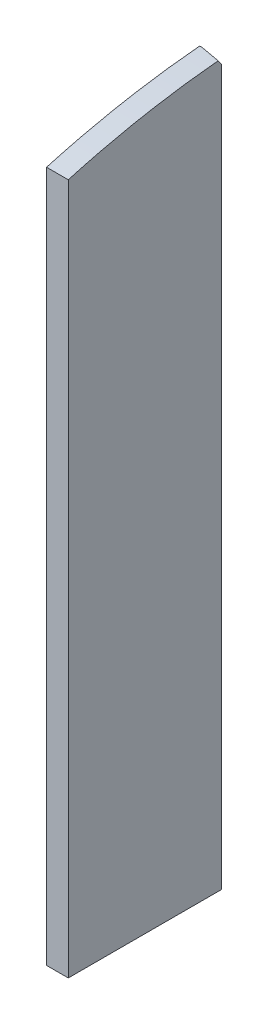
ISO-10303-21;
HEADER;
FILE_DESCRIPTION(('STEP AP214'),'2;1');
FILE_NAME('part.step','',(''),(''),'','','');
FILE_SCHEMA(('AUTOMOTIVE_DESIGN { 1 0 10303 214 1 1 1 1 }'));
ENDSEC;
DATA;
#1=APPLICATION_CONTEXT('core data for automotive mechanical design processes');
#2=APPLICATION_PROTOCOL_DEFINITION('international standard','automotive_design',2000,#1);
#3=PRODUCT_CONTEXT('',#1,'mechanical');
#4=PRODUCT('Part','Part','',(#3));
#5=PRODUCT_RELATED_PRODUCT_CATEGORY('part','',(#4));
#6=PRODUCT_DEFINITION_FORMATION('','',#4);
#7=PRODUCT_DEFINITION_CONTEXT('part definition',#1,'design');
#8=PRODUCT_DEFINITION('design','',#6,#7);
#9=PRODUCT_DEFINITION_SHAPE('','',#8);
#10=(LENGTH_UNIT() NAMED_UNIT(*) SI_UNIT(.MILLI.,.METRE.));
#11=(NAMED_UNIT(*) PLANE_ANGLE_UNIT() SI_UNIT($,.RADIAN.));
#12=(NAMED_UNIT(*) SI_UNIT($,.STERADIAN.) SOLID_ANGLE_UNIT());
#13=UNCERTAINTY_MEASURE_WITH_UNIT(LENGTH_MEASURE(1.E-05),#10,'distance_accuracy_value','');
#14=(GEOMETRIC_REPRESENTATION_CONTEXT(3) GLOBAL_UNCERTAINTY_ASSIGNED_CONTEXT((#13)) GLOBAL_UNIT_ASSIGNED_CONTEXT((#10,
#11,#12)) REPRESENTATION_CONTEXT('',''));
#15=CARTESIAN_POINT('',(0.,0.,0.));
#16=DIRECTION('',(0.,0.,1.));
#17=DIRECTION('',(1.,0.,0.));
#18=AXIS2_PLACEMENT_3D('',#15,#16,#17);
#19=CARTESIAN_POINT('',(137.996769754844,108.257843293921,-0.0146651977824064));
#20=CARTESIAN_POINT('',(137.994470663208,108.263185932301,-0.0146689009284984));
#21=CARTESIAN_POINT('',(137.982846026464,108.272814738817,-0.0146754617601488));
#22=CARTESIAN_POINT('',(137.963867876242,108.292735283424,-0.014689932275715));
#23=CARTESIAN_POINT('',(137.929041901144,108.327108424855,-0.0147177536108103));
#24=CARTESIAN_POINT('',(137.859647450429,108.396180652248,-0.0147853859447906));
#25=CARTESIAN_POINT('',(137.720700231209,108.533729372207,-0.0149685636029773));
#26=CARTESIAN_POINT('',(137.441427493966,108.808046570046,-0.0155738859695163));
#27=CARTESIAN_POINT('',(137.038615499986,109.196243163778,-0.0172511240750879));
#28=CARTESIAN_POINT('',(136.546124174744,109.655278297939,-0.0205386470483546));
#29=CARTESIAN_POINT('',(135.874634570935,110.256454296338,-0.0267672507374783));
#30=CARTESIAN_POINT('',(134.999940648767,110.983855613431,-0.0382928230639124));
#31=CARTESIAN_POINT('',(133.877635548201,111.808260544584,-0.0570483412825666));
#32=CARTESIAN_POINT('',(132.862991226325,112.4422476727,-0.0756814254816192));
#33=CARTESIAN_POINT('',(132.002753907315,112.914961512843,-0.0897246388646096));
#34=CARTESIAN_POINT('',(131.334430505124,113.252920592149,-0.0990531361415634));
#35=CARTESIAN_POINT('',(130.644203811735,113.574264764561,-0.107114757177058));
#36=CARTESIAN_POINT('',(129.934043249993,113.879283140582,-0.114505880462247));
#37=CARTESIAN_POINT('',(129.204854210968,114.168165488837,-0.121098023968528));
#38=CARTESIAN_POINT('',(127.710041789945,114.71321242481,-0.132470685501318));
#39=CARTESIAN_POINT('',(125.871696146492,115.259830104986,-0.142572036123596));
#40=CARTESIAN_POINT('',(123.66821724072,115.758090222137,-0.151320159220091));
#41=CARTESIAN_POINT('',(121.971530023146,116.067506622052,-0.156828844327976));
#42=CARTESIAN_POINT('',(120.237761712036,116.309534388152,-0.161268807965229));
#43=CARTESIAN_POINT('',(117.888826314194,116.540102295787,-0.165351120102883));
#44=CARTESIAN_POINT('',(116.099655086256,116.60985716227,-0.166533184205292));
#45=CARTESIAN_POINT('',(114.908179899786,116.609856795721,-0.166533176427691));
#46=CARTESIAN_POINT('',(114.908166137461,116.60985679571,-0.166533176427521));
#47=CARTESIAN_POINT('',(137.510472650716,107.853561762914,-0.404082727568849));
#48=CARTESIAN_POINT('',(137.507376811193,107.858650018985,-0.404084035787676));
#49=CARTESIAN_POINT('',(137.496391289046,107.868240285266,-0.404086097357336));
#50=CARTESIAN_POINT('',(137.477433389192,107.887690071594,-0.404091100485076));
#51=CARTESIAN_POINT('',(137.443115760932,107.921468114241,-0.404101312217748));
#52=CARTESIAN_POINT('',(137.374606337068,107.989271449082,-0.404128914365074));
#53=CARTESIAN_POINT('',(137.237538732582,108.124383396394,-0.404213210836488));
#54=CARTESIAN_POINT('',(136.962448125101,108.393903765985,-0.404529353106071));
#55=CARTESIAN_POINT('',(136.566783767691,108.776164756471,-0.40549162522133));
#56=CARTESIAN_POINT('',(136.085158319561,109.229282497896,-0.407475000925118));
#57=CARTESIAN_POINT('',(135.430759848289,109.824227268196,-0.411336644773044));
#58=CARTESIAN_POINT('',(134.582075996943,110.547013075342,-0.418684759456099));
#59=CARTESIAN_POINT('',(133.496398206565,111.370213332547,-0.430796964507991));
#60=CARTESIAN_POINT('',(132.514340627424,112.006246471685,-0.442838290777175));
#61=CARTESIAN_POINT('',(131.678968006703,112.480506057578,-0.45191065579327));
#62=CARTESIAN_POINT('',(131.028108580325,112.818899096114,-0.457939508081736));
#63=CARTESIAN_POINT('',(130.354239686885,113.139950158149,-0.46315372611339));
#64=CARTESIAN_POINT('',(129.660076796346,113.444459173849,-0.467938529003803));
#65=CARTESIAN_POINT('',(128.946469220164,113.732516153901,-0.472208534289351));
#66=CARTESIAN_POINT('',(127.482070555638,114.275093943274,-0.479574852615798));
#67=CARTESIAN_POINT('',(125.679020566952,114.818417911478,-0.486118237088277));
#68=CARTESIAN_POINT('',(123.516509181712,115.313474704004,-0.491786875521342));
#69=CARTESIAN_POINT('',(121.851025927126,115.620986894062,-0.495357769785272));
#70=CARTESIAN_POINT('',(120.148898682252,115.86164855112,-0.498236812866679));
#71=CARTESIAN_POINT('',(117.842377907619,116.090852182749,-0.50088390289315));
#72=CARTESIAN_POINT('',(116.085303321296,116.16018160392,-0.501650386384284));
#73=CARTESIAN_POINT('',(114.915212730575,116.160181444212,-0.501650383204009));
#74=CARTESIAN_POINT('',(114.915199215256,116.160181444204,-0.501650383203952));
#75=CARTESIAN_POINT('',(137.028967579147,107.452776598014,-0.781251585381611));
#76=CARTESIAN_POINT('',(137.025079598717,107.457612810647,-0.781250698582326));
#77=CARTESIAN_POINT('',(137.014735660684,107.467165029554,-0.781248515581254));
#78=CARTESIAN_POINT('',(136.995808478246,107.486148551273,-0.781244669848505));
#79=CARTESIAN_POINT('',(136.962014240697,107.519337304045,-0.781238379235461));
#80=CARTESIAN_POINT('',(136.894420859289,107.585884032849,-0.781228460955006));
#81=CARTESIAN_POINT('',(136.759292560085,107.718582721483,-0.781219991505921));
#82=CARTESIAN_POINT('',(136.488498533104,107.983351886824,-0.781264522171981));
#83=CARTESIAN_POINT('',(136.100120316995,108.35973198774,-0.781554434574005));
#84=CARTESIAN_POINT('',(135.62948797464,108.806983927222,-0.782310359699025));
#85=CARTESIAN_POINT('',(134.99229494968,109.395746919926,-0.783942913123056));
#86=CARTESIAN_POINT('',(134.169654987907,110.11394223491,-0.787353931602141));
#87=CARTESIAN_POINT('',(133.120482780799,110.935917827621,-0.793198975367162));
#88=CARTESIAN_POINT('',(132.170796362804,111.573945759457,-0.799015279279175));
#89=CARTESIAN_POINT('',(131.360093934042,112.049712166026,-0.803389474830126));
#90=CARTESIAN_POINT('',(130.726555126049,112.388518472168,-0.806298129298355));
#91=CARTESIAN_POINT('',(130.068903419048,112.709264358142,-0.808818529400483));
#92=CARTESIAN_POINT('',(129.390590139335,113.013254913991,-0.811136572983756));
#93=CARTESIAN_POINT('',(128.692410643563,113.300481502575,-0.81320789809179));
#94=CARTESIAN_POINT('',(127.258110909581,113.840590165171,-0.816779380483254));
#95=CARTESIAN_POINT('',(125.489932244361,114.380629051224,-0.819949508562132));
#96=CARTESIAN_POINT('',(123.367823146718,114.872492225539,-0.822696726453927));
#97=CARTESIAN_POINT('',(121.733082427368,115.178105005634,-0.824428643015011));
#98=CARTESIAN_POINT('',(120.062103692994,115.417402786164,-0.825825984172099));
#99=CARTESIAN_POINT('',(117.797312161971,115.645244996051,-0.827110311589735));
#100=CARTESIAN_POINT('',(116.071796805745,115.714150022894,-0.827482082903629));
#101=CARTESIAN_POINT('',(114.922732355561,115.714150069149,-0.827482083315573));
#102=CARTESIAN_POINT('',(114.922719083107,115.714150069143,-0.827482083315516));
#103=CARTESIAN_POINT('',(136.552016344677,107.0563117822,-1.14566927671962));
#104=CARTESIAN_POINT('',(136.547340432649,107.060898350425,-1.14566637025268));
#105=CARTESIAN_POINT('',(136.537639161453,107.070413329829,-1.14566030054095));
#106=CARTESIAN_POINT('',(136.518750578082,107.088935524444,-1.14564833369843));
#107=CARTESIAN_POINT('',(136.485490308103,107.121541675051,-1.14562688610363));
#108=CARTESIAN_POINT('',(136.418835051944,107.186845781945,-1.1455824366771));
#109=CARTESIAN_POINT('',(136.285688199523,107.317158044883,-1.14548834885238));
#110=CARTESIAN_POINT('',(136.0192709141,107.577227718333,-1.14528122624802));
#111=CARTESIAN_POINT('',(135.63827199632,107.94778883681,-1.14494591370277));
#112=CARTESIAN_POINT('',(135.17871163924,108.389232720069,-1.14455812912644));
#113=CARTESIAN_POINT('',(134.558782896402,108.971867893528,-1.14411104218249));
#114=CARTESIAN_POINT('',(133.76216940203,109.68549577779,-1.14384388679329));
#115=CARTESIAN_POINT('',(132.74934888641,110.506212957014,-1.1438250297044));
#116=CARTESIAN_POINT('',(131.831812742248,111.146164584988,-1.14380813365986));
#117=CARTESIAN_POINT('',(131.045588362452,111.623383271963,-1.14377528142089));
#118=CARTESIAN_POINT('',(130.429229882475,111.962572146577,-1.14375543673324));
#119=CARTESIAN_POINT('',(129.787658918469,112.282992673288,-1.14374628885744));
#120=CARTESIAN_POINT('',(129.125054001999,112.586448332808,-1.14374693152016));
#121=CARTESIAN_POINT('',(128.4421582645,112.872833218141,-1.14375185044409));
#122=CARTESIAN_POINT('',(127.037664698078,113.410462684913,-1.14375554847331));
#123=CARTESIAN_POINT('',(125.303975400221,113.947217065625,-1.14375142174711));
#124=CARTESIAN_POINT('',(123.221772633496,114.435889587303,-1.143747913775));
#125=CARTESIAN_POINT('',(121.617374520222,114.739603296592,-1.14374755467472));
#126=CARTESIAN_POINT('',(119.977121078003,114.977535611407,-1.14374867907284));
#127=CARTESIAN_POINT('',(117.753473199096,115.204015867117,-1.14374853408324));
#128=CARTESIAN_POINT('',(116.059060502344,115.27249663845,-1.1437481533865));
#129=CARTESIAN_POINT('',(114.930717710983,115.272496891759,-1.1437481533894));
#130=CARTESIAN_POINT('',(114.930704677879,115.272496891756,-1.1437481533894));
#131=(BOUNDED_SURFACE() B_SPLINE_SURFACE(3,3,((#19,#20,#21,#22,#23,#24,#25,#26,#27,#28,#29,#30,
#31,#32,#33,#34,#35,#36,#37,#38,#39,#40,#41,#42,#43,#44,#45,#46),(#47,#48,#49,#50,#51,#52,#53,
#54,#55,#56,#57,#58,#59,#60,#61,#62,#63,#64,#65,#66,#67,#68,#69,#70,#71,#72,#73,#74),(#75,#76,
#77,#78,#79,#80,#81,#82,#83,#84,#85,#86,#87,#88,#89,#90,#91,#92,#93,#94,#95,#96,#97,#98,#99,
#100,#101,#102),(#103,#104,#105,#106,#107,#108,#109,#110,#111,#112,#113,#114,#115,#116,#117,
#118,#119,#120,#121,#122,#123,#124,#125,#126,#127,#128,#129,#130)),.UNSPECIFIED.,.F.,.F.,
.F.) B_SPLINE_SURFACE_WITH_KNOTS((4,4),(4,1,1,1,1,1,1,1,1,1,1,1,1,1,1,1,1,1,1,1,1,1,1,1,1,4),
(-8.3522230805065,0.),(0.,0.0293809287067883,0.0587618574135476,0.117523714827124,
0.235047429654219,0.470094859308468,0.940189718616906,1.88037943723384,2.82056915585075,
3.76075887446765,5.64113831170148,7.52151774893531,9.40189718616914,10.342086904786,
11.282276623403,12.2224663420199,13.1626560606368,14.1028457792537,15.0430354978706,
18.8037943723383,20.6841738095721,22.5645532468059,24.4449326840398,26.3253121212736,
30.0860709957413,30.0861144354926),
.UNSPECIFIED.) GEOMETRIC_REPRESENTATION_ITEM() RATIONAL_B_SPLINE_SURFACE(((1.,1.,1.,1.,1.,1.,1.,
1.,1.,1.,1.,1.,1.,1.,1.,1.,1.,1.,1.,1.,1.,1.,1.,1.,1.,1.,1.,1.),(1.,1.,1.,1.,1.,1.,1.,1.,1.,1.,
1.,1.,1.,1.,1.,1.,1.,1.,1.,1.,1.,1.,1.,1.,1.,1.,1.,1.),(1.,1.,1.,1.,1.,1.,1.,1.,1.,1.,1.,1.,1.,
1.,1.,1.,1.,1.,1.,1.,1.,1.,1.,1.,1.,1.,1.,1.),(1.,1.,1.,1.,1.,1.,1.,1.,1.,1.,1.,1.,1.,1.,1.,1.,
1.,1.,1.,1.,1.,1.,1.,1.,1.,1.,1.,1.))) REPRESENTATION_ITEM('') SURFACE());
#132=CARTESIAN_POINT('',(125.611863853578,114.458273275457,-0.721874428030815));
#133=CARTESIAN_POINT('',(125.463451471204,114.499333016987,-0.721874428030816));
#134=CARTESIAN_POINT('',(125.314749018483,114.53939972764,-0.721874428030818));
#135=CARTESIAN_POINT('',(125.015485306817,114.617933897569,-0.721874428030818));
#136=CARTESIAN_POINT('',(124.86488574086,114.656392075853,-0.721874428030816));
#137=CARTESIAN_POINT('',(124.714060860279,114.693871368356,-0.721874428030816));
#138=(BOUNDED_CURVE() B_SPLINE_CURVE(3,(#132,#133,#134,#135,#136,#137),.UNSPECIFIED.,.F.,
.F.) B_SPLINE_CURVE_WITH_KNOTS((4,2,4),(2.20613607809466E-06,0.0461984434974361,
0.0928211827387005),
.UNSPECIFIED.) CURVE() GEOMETRIC_REPRESENTATION_ITEM() RATIONAL_B_SPLINE_CURVE((1.,1.,1.,1.,1.,1.)) REPRESENTATION_ITEM(''));
#139=CARTESIAN_POINT('',(125.611863853257,114.458273274294,-0.721874428413041));
#140=VERTEX_POINT('',#139);
#141=CARTESIAN_POINT('',(124.714060860279,114.693871368356,-0.721874428030816));
#142=VERTEX_POINT('',#141);
#143=EDGE_CURVE('E79',#140,#142,#138,.T.);
#144=CARTESIAN_POINT('',(124.714060860279,114.693871368356,-0.72187442803081));
#145=CARTESIAN_POINT('',(124.863878035981,114.691749144793,-0.697707582768163));
#146=CARTESIAN_POINT('',(125.013604251571,114.689555666686,-0.673003538887846));
#147=CARTESIAN_POINT('',(125.31287785298,114.68501961564,-0.622520679572594));
#148=CARTESIAN_POINT('',(125.462413209262,114.682677225389,-0.596743885043277));
#149=CARTESIAN_POINT('',(125.611863976246,114.680256815695,-0.570429074536454));
#150=(BOUNDED_CURVE() B_SPLINE_CURVE(3,(#144,#145,#146,#147,#148,#149),.UNSPECIFIED.,.F.,
.F.) B_SPLINE_CURVE_WITH_KNOTS((4,2,4),(-0.0910606726124408,-0.0455309547577194,
-4.50166483950687E-07),
.UNSPECIFIED.) CURVE() GEOMETRIC_REPRESENTATION_ITEM() RATIONAL_B_SPLINE_CURVE((1.,1.,1.,1.,1.,1.)) REPRESENTATION_ITEM(''));
#151=CARTESIAN_POINT('',(125.611863894028,114.680257834909,-0.570418544166174));
#152=VERTEX_POINT('',#151);
#153=EDGE_CURVE('E52',#142,#152,#150,.T.);
#154=CARTESIAN_POINT('',(125.611863852919,114.458273274542,-0.721874428776832));
#155=CARTESIAN_POINT('',(125.611863852919,114.495272178833,-0.696726084520489));
#156=CARTESIAN_POINT('',(125.611863852919,114.532249679672,-0.671545345912547));
#157=CARTESIAN_POINT('',(125.611863852919,114.606245823806,-0.621062453588089));
#158=CARTESIAN_POINT('',(125.611863852919,114.643265201055,-0.595759583081696));
#159=CARTESIAN_POINT('',(125.611863852919,114.680262429301,-0.570425253630257));
#160=(BOUNDED_CURVE() B_SPLINE_CURVE(3,(#154,#155,#156,#157,#158,#159),.UNSPECIFIED.,.F.,
.F.) B_SPLINE_CURVE_WITH_KNOTS((4,2,4),(-0.0268773713624533,-0.0134564083150691,
-4.4166207355008E-06),
.UNSPECIFIED.) CURVE() GEOMETRIC_REPRESENTATION_ITEM() RATIONAL_B_SPLINE_CURVE((1.,1.,1.,1.,1.,1.)) REPRESENTATION_ITEM(''));
#161=EDGE_CURVE('E133',#140,#152,#160,.T.);
#162=ORIENTED_EDGE('',*,*,#143,.T.);
#163=ORIENTED_EDGE('',*,*,#153,.T.);
#164=ORIENTED_EDGE('',*,*,#161,.F.);
#165=EDGE_LOOP('',(#162,#163,#164));
#166=FACE_BOUND('',#165,.T.);
#167=ADVANCED_FACE('F40',(#166),#131,.T.);
#168=CARTESIAN_POINT('',(125.611863852919,81.5619643145119,6.32878809828097));
#169=DIRECTION('',(0.,0.,1.));
#170=DIRECTION('',(0.,-1.,0.));
#171=AXIS2_PLACEMENT_3D('',#168,#169,#170);
#172=PLANE('',#171);
#173=DIRECTION('',(0.,-1.,0.));
#174=VECTOR('',#173,1.);
#175=CARTESIAN_POINT('',(125.611863852919,113.386320542812,6.32878809828087));
#176=LINE('',#175,#174);
#177=CARTESIAN_POINT('',(125.611863852919,113.386320542812,6.32878809828087));
#178=VERTEX_POINT('',#177);
#179=CARTESIAN_POINT('',(125.611863852919,81.5619643145119,6.32878809828097));
#180=VERTEX_POINT('',#179);
#181=EDGE_CURVE('E114',#178,#180,#176,.T.);
#182=ORIENTED_EDGE('',*,*,#181,.F.);
#183=DIRECTION('',(-1.,0.,0.));
#184=VECTOR('',#183,1.);
#185=CARTESIAN_POINT('',(125.611863852919,113.386320542812,6.32878809828087));
#186=LINE('',#185,#184);
#187=CARTESIAN_POINT('',(124.611863852919,113.386320542812,6.32878809828087));
#188=VERTEX_POINT('',#187);
#189=EDGE_CURVE('E124',#178,#188,#186,.T.);
#190=ORIENTED_EDGE('',*,*,#189,.T.);
#191=DIRECTION('',(0.,-1.,0.));
#192=VECTOR('',#191,1.);
#193=CARTESIAN_POINT('',(124.611863852919,113.386320542812,6.32878809828087));
#194=LINE('',#193,#192);
#195=CARTESIAN_POINT('',(124.611863852919,81.5619643145119,6.32878809828097));
#196=VERTEX_POINT('',#195);
#197=EDGE_CURVE('E105',#188,#196,#194,.T.);
#198=ORIENTED_EDGE('',*,*,#197,.T.);
#199=DIRECTION('',(1.,0.,0.));
#200=VECTOR('',#199,1.);
#201=CARTESIAN_POINT('',(124.611863852919,81.5619643145119,6.32878809828097));
#202=LINE('',#201,#200);
#203=EDGE_CURVE('E11',#196,#180,#202,.T.);
#204=ORIENTED_EDGE('',*,*,#203,.T.);
#205=EDGE_LOOP('',(#182,#190,#198,#204));
#206=FACE_BOUND('',#205,.T.);
#207=ADVANCED_FACE('F159',(#206),#172,.T.);
#208=CARTESIAN_POINT('',(125.111863852919,81.5619643145119,14.1660672814716));
#209=DIRECTION('',(0.,-1.,0.));
#210=DIRECTION('',(0.,0.,-1.));
#211=AXIS2_PLACEMENT_3D('',#208,#209,#210);
#212=PLANE('',#211);
#213=DIRECTION('',(0.,0.,-1.));
#214=VECTOR('',#213,1.);
#215=CARTESIAN_POINT('',(124.611863852919,81.5619643145119,6.32878809828097));
#216=LINE('',#215,#214);
#217=CARTESIAN_POINT('',(124.611863852919,81.5619643145119,-0.721874428030759));
#218=VERTEX_POINT('',#217);
#219=EDGE_CURVE('E101',#196,#218,#216,.T.);
#220=ORIENTED_EDGE('',*,*,#219,.T.);
#221=DIRECTION('',(-1.,0.,0.));
#222=VECTOR('',#221,1.);
#223=CARTESIAN_POINT('',(125.611863852919,81.5619643145119,-0.721874428030759));
#224=LINE('',#223,#222);
#225=CARTESIAN_POINT('',(125.611863852919,81.5619643145119,-0.721874428030759));
#226=VERTEX_POINT('',#225);
#227=EDGE_CURVE('E95',#226,#218,#224,.T.);
#228=ORIENTED_EDGE('',*,*,#227,.F.);
#229=DIRECTION('',(0.,0.,-1.));
#230=VECTOR('',#229,1.);
#231=CARTESIAN_POINT('',(125.611863852919,81.5619643145119,6.32878809828097));
#232=LINE('',#231,#230);
#233=EDGE_CURVE('E98',#180,#226,#232,.T.);
#234=ORIENTED_EDGE('',*,*,#233,.F.);
#235=ORIENTED_EDGE('',*,*,#203,.F.);
#236=EDGE_LOOP('',(#220,#228,#234,#235));
#237=FACE_BOUND('',#236,.T.);
#238=ADVANCED_FACE('F96',(#237),#212,.T.);
#239=CARTESIAN_POINT('',(125.611863852919,114.693871368356,-0.721874428030816));
#240=CARTESIAN_POINT('',(124.411863852919,114.693871368356,-0.721874428030816));
#241=CARTESIAN_POINT('',(125.611863852919,114.593132991804,0.425284995218334));
#242=CARTESIAN_POINT('',(124.411863852919,114.593132991804,0.425284995218334));
#243=CARTESIAN_POINT('',(125.611863852919,114.43837487725,1.56942444799219));
#244=CARTESIAN_POINT('',(124.411863852919,114.43837487725,1.56942444799219));
#245=CARTESIAN_POINT('',(125.611863852919,114.231931561013,2.70316256949073));
#246=CARTESIAN_POINT('',(124.411863852919,114.231931561013,2.70316256949073));
#247=CARTESIAN_POINT('',(125.611863852919,114.073911996315,3.57096884050802));
#248=CARTESIAN_POINT('',(124.411863852919,114.073911996315,3.57096884050802));
#249=CARTESIAN_POINT('',(125.611863852919,113.885486885392,4.43338224717982));
#250=CARTESIAN_POINT('',(124.411863852919,113.885486885392,4.43338224717982));
#251=CARTESIAN_POINT('',(125.611863852919,113.6673755514,5.28806416190314));
#252=CARTESIAN_POINT('',(124.411863852919,113.6673755514,5.28806416190314));
#253=CARTESIAN_POINT('',(125.611863852919,113.429806278742,6.2189931380248));
#254=CARTESIAN_POINT('',(124.411863852919,113.429806278742,6.2189931380248));
#255=CARTESIAN_POINT('',(125.611863852919,113.155789957766,7.1455588916234));
#256=CARTESIAN_POINT('',(124.411863852919,113.155789957766,7.1455588916234));
#257=CARTESIAN_POINT('',(125.611863852919,112.852853509122,8.05726099115746));
#258=CARTESIAN_POINT('',(124.411863852919,112.852853509122,8.05726099115746));
#259=CARTESIAN_POINT('',(125.611863852919,112.546302948539,8.97983993782439));
#260=CARTESIAN_POINT('',(124.411863852919,112.546302948539,8.97983993782439));
#261=CARTESIAN_POINT('',(125.611863852919,112.207250987622,9.89594795173836));
#262=CARTESIAN_POINT('',(124.411863852919,112.207250987622,9.89594795173836));
#263=CARTESIAN_POINT('',(125.611863852919,111.842740230479,10.7971588153841));
#264=CARTESIAN_POINT('',(124.411863852919,111.842740230479,10.7971588153841));
#265=CARTESIAN_POINT('',(125.611863852919,111.817805897079,10.858806082843));
#266=CARTESIAN_POINT('',(124.411863852919,111.817805897079,10.858806082843));
#267=CARTESIAN_POINT('',(125.611863852919,111.792744817781,10.9204025739335));
#268=CARTESIAN_POINT('',(124.411863852919,111.792744817781,10.9204025739335));
#269=CARTESIAN_POINT('',(125.611863852919,111.767558404928,10.9819470566923));
#270=CARTESIAN_POINT('',(124.411863852919,111.767558404928,10.9819470566923));
#271=CARTESIAN_POINT('',(125.611863852919,111.348399468635,12.0061865972319));
#272=CARTESIAN_POINT('',(124.411863852919,111.348399468635,12.0061865972319));
#273=CARTESIAN_POINT('',(125.611863852919,110.893423700899,13.0187188961143));
#274=CARTESIAN_POINT('',(124.411863852919,110.893423700899,13.0187188961143));
#275=CARTESIAN_POINT('',(125.611863852919,110.402822797709,14.0107678907567));
#276=CARTESIAN_POINT('',(124.411863852919,110.402822797709,14.0107678907567));
#277=CARTESIAN_POINT('',(125.611863852919,110.377200232236,14.0625795367453));
#278=CARTESIAN_POINT('',(124.411863852919,110.377200232236,14.0625795367453));
#279=CARTESIAN_POINT('',(125.611863852919,110.351475008834,14.1143464039091));
#280=CARTESIAN_POINT('',(124.411863852919,110.351475008834,14.1143464039091));
#281=CARTESIAN_POINT('',(125.611863852919,110.325647005445,14.1660672814714));
#282=CARTESIAN_POINT('',(124.411863852919,110.325647005445,14.1660672814714));
#283=(BOUNDED_SURFACE() B_SPLINE_SURFACE(3,1,((#239,#240),(#241,#242),(#243,#244),(#245,#246),
(#247,#248),(#249,#250),(#251,#252),(#253,#254),(#255,#256),(#257,#258),(#259,#260),(#261,#262),
(#263,#264),(#265,#266),(#267,#268),(#269,#270),(#271,#272),(#273,#274),(#275,#276),(#277,#278),
(#279,#280),(#281,#282)),.UNSPECIFIED.,.F.,.F.,.F.) B_SPLINE_SURFACE_WITH_KNOTS((4,3,3,3,3,3,3,
4),(2,2),(-1.05572550338823,2.4026804886413,5.04958749407472,7.93730010123336,10.8584487397272,
11.0579458880345,14.3814207751686,14.5549785190155),(0.,0.120000000000002),
.UNSPECIFIED.) GEOMETRIC_REPRESENTATION_ITEM() RATIONAL_B_SPLINE_SURFACE(((1.,1.),(1.,1.),(1.,
1.),(1.,1.),(1.,1.),(1.,1.),(1.,1.),(1.,1.),(1.,1.),(1.,1.),(1.,1.),(1.,1.),(1.,1.),(1.,1.),(1.,
1.),(1.,1.),(1.,1.),(1.,1.),(1.,1.),(1.,1.),(1.,1.),(1.,1.))) REPRESENTATION_ITEM('') SURFACE());
#284=DIRECTION('',(-1.,0.,0.));
#285=VECTOR('',#284,1.);
#286=CARTESIAN_POINT('',(124.714060860279,114.693871368356,-0.721874428030816));
#287=LINE('',#286,#285);
#288=CARTESIAN_POINT('',(124.611863852919,114.693871368356,-0.721874428030816));
#289=VERTEX_POINT('',#288);
#290=EDGE_CURVE('E104',#142,#289,#287,.T.);
#291=CARTESIAN_POINT('',(124.611863852919,114.693871368356,-0.721874428030816));
#292=CARTESIAN_POINT('',(124.611863852919,114.593132991804,0.425284995218334));
#293=CARTESIAN_POINT('',(124.611863852919,114.43837487725,1.56942444799219));
#294=CARTESIAN_POINT('',(124.611863852919,114.231931561013,2.70316256949073));
#295=CARTESIAN_POINT('',(124.611863852919,114.073911996315,3.57096884050802));
#296=CARTESIAN_POINT('',(124.611863852919,113.885486885392,4.43338224717976));
#297=CARTESIAN_POINT('',(124.611863852919,113.6673755514,5.28806416190314));
#298=CARTESIAN_POINT('',(124.611863852919,113.578644182837,5.63576317685737));
#299=CARTESIAN_POINT('',(124.611863852919,113.484828455526,5.98285352280742));
#300=CARTESIAN_POINT('',(124.611863852919,113.386320542812,6.32878809828087));
#301=(BOUNDED_CURVE() B_SPLINE_CURVE(3,(#291,#292,#293,#294,#295,#296,#297,#298,#299,#300),
.UNSPECIFIED.,.F.,.F.) B_SPLINE_CURVE_WITH_KNOTS((4,3,3,4),(-1.05572550338823,2.4026804886413,
5.04958749407472,6.12813897838123),
.UNSPECIFIED.) CURVE() GEOMETRIC_REPRESENTATION_ITEM() RATIONAL_B_SPLINE_CURVE((1.,1.,1.,1.,1.,
1.,1.,1.,1.,1.)) REPRESENTATION_ITEM(''));
#302=EDGE_CURVE('E110',#289,#188,#301,.T.);
#303=CARTESIAN_POINT('',(125.611863852919,114.680254261309,-0.570401303251145));
#304=CARTESIAN_POINT('',(125.611863852919,114.579408167824,0.525993173393288));
#305=CARTESIAN_POINT('',(125.611863852919,114.429287396259,1.61933075552818));
#306=CARTESIAN_POINT('',(125.611863852919,114.231931561013,2.70316256949073));
#307=CARTESIAN_POINT('',(125.611863852919,114.073911996315,3.57096884050802));
#308=CARTESIAN_POINT('',(125.611863852919,113.885486885392,4.43338224717982));
#309=CARTESIAN_POINT('',(125.611863852919,113.6673755514,5.28806416190314));
#310=CARTESIAN_POINT('',(125.611863852919,113.578644182837,5.63576317685737));
#311=CARTESIAN_POINT('',(125.611863852919,113.484828455526,5.98285352280742));
#312=CARTESIAN_POINT('',(125.611863852919,113.386320542812,6.32878809828087));
#313=(BOUNDED_CURVE() B_SPLINE_CURVE(3,(#303,#304,#305,#306,#307,#308,#309,#310,#311,#312),
.UNSPECIFIED.,.F.,.F.) B_SPLINE_CURVE_WITH_KNOTS((4,3,3,4),(-0.903489047940819,2.4026804886413,
5.04958749407472,6.12813897838123),
.UNSPECIFIED.) CURVE() GEOMETRIC_REPRESENTATION_ITEM() RATIONAL_B_SPLINE_CURVE((1.,1.,1.,1.,1.,
1.,1.,1.,1.,1.)) REPRESENTATION_ITEM(''));
#314=EDGE_CURVE('E116',#152,#178,#313,.T.);
#315=ORIENTED_EDGE('',*,*,#290,.T.);
#316=ORIENTED_EDGE('',*,*,#302,.T.);
#317=ORIENTED_EDGE('',*,*,#189,.F.);
#318=ORIENTED_EDGE('',*,*,#314,.F.);
#319=ORIENTED_EDGE('',*,*,#153,.F.);
#320=EDGE_LOOP('',(#315,#316,#317,#318,#319));
#321=FACE_BOUND('',#320,.T.);
#322=ADVANCED_FACE('F143',(#321),#283,.F.);
#323=CARTESIAN_POINT('',(125.111863852919,81.5619643145119,-0.721874428030759));
#324=DIRECTION('',(0.,0.,-1.));
#325=DIRECTION('',(0.,-1.,0.));
#326=AXIS2_PLACEMENT_3D('',#323,#324,#325);
#327=PLANE('',#326);
#328=DIRECTION('',(0.,1.,0.));
#329=VECTOR('',#328,1.);
#330=CARTESIAN_POINT('',(125.611863852919,81.5619643145119,-0.721874428030759));
#331=LINE('',#330,#329);
#332=EDGE_CURVE('E107',#226,#140,#331,.T.);
#333=ORIENTED_EDGE('',*,*,#332,.F.);
#334=ORIENTED_EDGE('',*,*,#227,.T.);
#335=DIRECTION('',(0.,1.,0.));
#336=VECTOR('',#335,1.);
#337=CARTESIAN_POINT('',(124.611863852919,81.5619643145119,-0.721874428030759));
#338=LINE('',#337,#336);
#339=EDGE_CURVE('E121',#218,#289,#338,.T.);
#340=ORIENTED_EDGE('',*,*,#339,.T.);
#341=ORIENTED_EDGE('',*,*,#290,.F.);
#342=ORIENTED_EDGE('',*,*,#143,.F.);
#343=EDGE_LOOP('',(#333,#334,#340,#341,#342));
#344=FACE_BOUND('',#343,.T.);
#345=ADVANCED_FACE('F42',(#344),#327,.T.);
#346=CARTESIAN_POINT('',(124.611863852919,97.7208956128326,-0.721874428030787));
#347=DIRECTION('',(-1.,0.,0.));
#348=DIRECTION('',(0.,1.,0.));
#349=AXIS2_PLACEMENT_3D('',#346,#347,#348);
#350=PLANE('',#349);
#351=ORIENTED_EDGE('',*,*,#302,.F.);
#352=ORIENTED_EDGE('',*,*,#339,.F.);
#353=ORIENTED_EDGE('',*,*,#219,.F.);
#354=ORIENTED_EDGE('',*,*,#197,.F.);
#355=EDGE_LOOP('',(#351,#352,#353,#354));
#356=FACE_BOUND('',#355,.T.);
#357=ADVANCED_FACE('F160',(#356),#350,.T.);
#358=CARTESIAN_POINT('',(125.611863852919,113.211433728121,6.92553983959142));
#359=DIRECTION('',(1.,0.,0.));
#360=DIRECTION('',(0.,0.,1.));
#361=AXIS2_PLACEMENT_3D('',#358,#359,#360);
#362=PLANE('',#361);
#363=ORIENTED_EDGE('',*,*,#161,.T.);
#364=ORIENTED_EDGE('',*,*,#314,.T.);
#365=ORIENTED_EDGE('',*,*,#181,.T.);
#366=ORIENTED_EDGE('',*,*,#233,.T.);
#367=ORIENTED_EDGE('',*,*,#332,.T.);
#368=EDGE_LOOP('',(#363,#364,#365,#366,#367));
#369=FACE_BOUND('',#368,.T.);
#370=ADVANCED_FACE('F112',(#369),#362,.T.);
#371=CLOSED_SHELL('',(#167,#207,#238,#322,#345,#357,#370));
#372=MANIFOLD_SOLID_BREP('B2',#371);
#373=ADVANCED_BREP_SHAPE_REPRESENTATION('',(#18,#372),#14);
#374=SHAPE_DEFINITION_REPRESENTATION(#9,#373);
ENDSEC;
END-ISO-10303-21;
